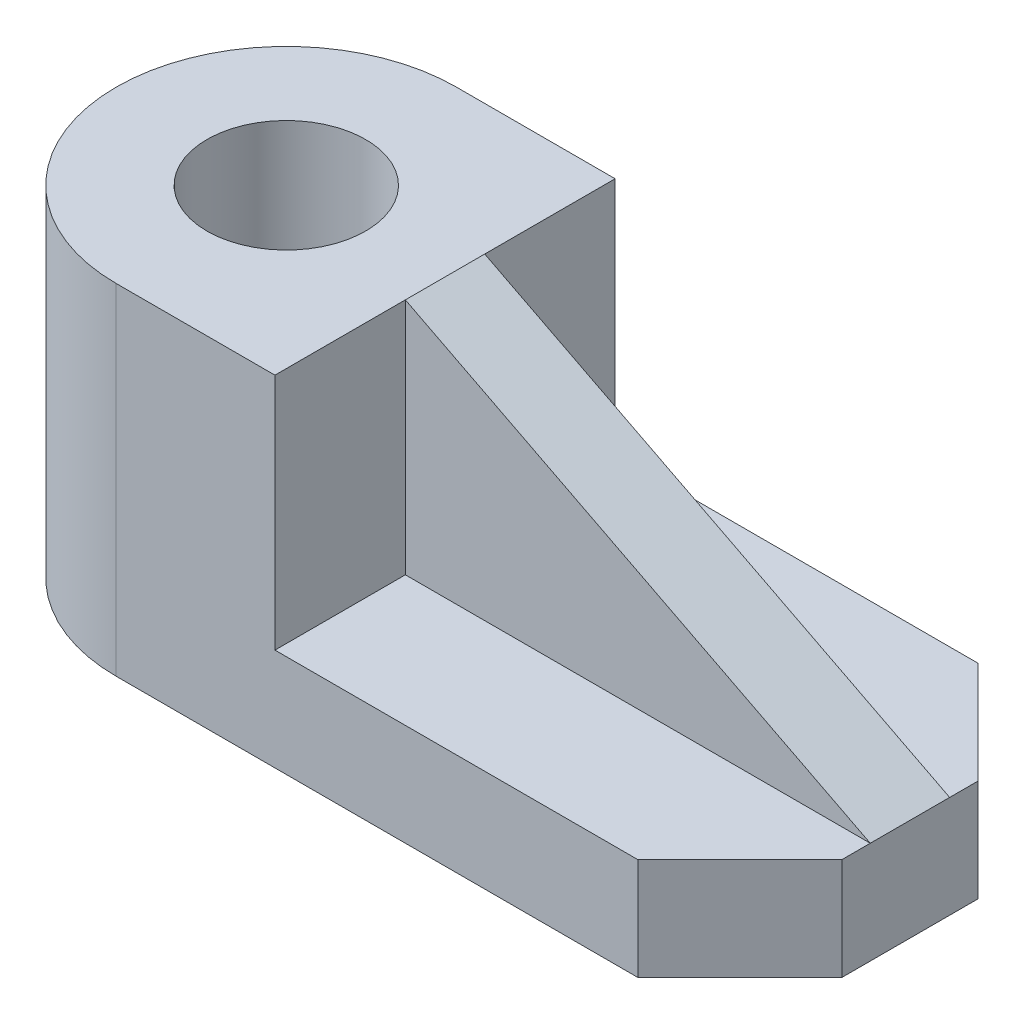
ISO-10303-21;
HEADER;
FILE_DESCRIPTION(('STEP AP214'),'2;1');
FILE_NAME('part.step','',(''),(''),'','','');
FILE_SCHEMA(('AUTOMOTIVE_DESIGN { 1 0 10303 214 1 1 1 1 }'));
ENDSEC;
DATA;
#1=APPLICATION_CONTEXT('core data for automotive mechanical design processes');
#2=APPLICATION_PROTOCOL_DEFINITION('international standard','automotive_design',2000,#1);
#3=PRODUCT_CONTEXT('',#1,'mechanical');
#4=PRODUCT('Part','Part','',(#3));
#5=PRODUCT_RELATED_PRODUCT_CATEGORY('part','',(#4));
#6=PRODUCT_DEFINITION_FORMATION('','',#4);
#7=PRODUCT_DEFINITION_CONTEXT('part definition',#1,'design');
#8=PRODUCT_DEFINITION('design','',#6,#7);
#9=PRODUCT_DEFINITION_SHAPE('','',#8);
#10=(LENGTH_UNIT() NAMED_UNIT(*) SI_UNIT(.MILLI.,.METRE.));
#11=(NAMED_UNIT(*) PLANE_ANGLE_UNIT() SI_UNIT($,.RADIAN.));
#12=(NAMED_UNIT(*) SI_UNIT($,.STERADIAN.) SOLID_ANGLE_UNIT());
#13=UNCERTAINTY_MEASURE_WITH_UNIT(LENGTH_MEASURE(1.E-05),#10,'distance_accuracy_value','');
#14=(GEOMETRIC_REPRESENTATION_CONTEXT(3) GLOBAL_UNCERTAINTY_ASSIGNED_CONTEXT((#13)) GLOBAL_UNIT_ASSIGNED_CONTEXT((#10,
#11,#12)) REPRESENTATION_CONTEXT('',''));
#15=CARTESIAN_POINT('',(0.,0.,0.));
#16=DIRECTION('',(0.,0.,1.));
#17=DIRECTION('',(1.,0.,0.));
#18=AXIS2_PLACEMENT_3D('',#15,#16,#17);
#19=CARTESIAN_POINT('',(-41.,9.,30.));
#20=DIRECTION('',(0.,-1.,0.));
#21=DIRECTION('',(0.,0.,-1.));
#22=AXIS2_PLACEMENT_3D('',#19,#20,#21);
#23=PLANE('',#22);
#24=DIRECTION('',(0.,0.,-1.));
#25=VECTOR('',#24,1.);
#26=CARTESIAN_POINT('',(0.,9.,30.));
#27=LINE('',#26,#25);
#28=CARTESIAN_POINT('',(0.,9.,11.5));
#29=VERTEX_POINT('',#28);
#30=CARTESIAN_POINT('',(0.,9.,9.00000000000004));
#31=VERTEX_POINT('',#30);
#32=EDGE_CURVE('E163',#29,#31,#27,.T.);
#33=ORIENTED_EDGE('',*,*,#32,.T.);
#34=DIRECTION('',(-0.707106781186548,0.,-0.707106781186548));
#35=VECTOR('',#34,1.);
#36=CARTESIAN_POINT('',(0.,9.,9.00000000000004));
#37=LINE('',#36,#35);
#38=CARTESIAN_POINT('',(-9.00000000000005,9.,0.));
#39=VERTEX_POINT('',#38);
#40=EDGE_CURVE('E202',#31,#39,#37,.T.);
#41=ORIENTED_EDGE('',*,*,#40,.T.);
#42=DIRECTION('',(-1.,0.,0.));
#43=VECTOR('',#42,1.);
#44=CARTESIAN_POINT('',(-41.,9.,0.));
#45=LINE('',#44,#43);
#46=CARTESIAN_POINT('',(-41.,9.,0.));
#47=VERTEX_POINT('',#46);
#48=EDGE_CURVE('E155',#39,#47,#45,.T.);
#49=ORIENTED_EDGE('',*,*,#48,.T.);
#50=DIRECTION('',(0.,0.,-1.));
#51=VECTOR('',#50,1.);
#52=CARTESIAN_POINT('',(-41.,9.,30.));
#53=LINE('',#52,#51);
#54=CARTESIAN_POINT('',(-41.,9.,11.5));
#55=VERTEX_POINT('',#54);
#56=EDGE_CURVE('E148',#55,#47,#53,.T.);
#57=ORIENTED_EDGE('',*,*,#56,.F.);
#58=DIRECTION('',(-1.,0.,0.));
#59=VECTOR('',#58,1.);
#60=CARTESIAN_POINT('',(0.,9.,11.5));
#61=LINE('',#60,#59);
#62=EDGE_CURVE('E130',#29,#55,#61,.T.);
#63=ORIENTED_EDGE('',*,*,#62,.F.);
#64=EDGE_LOOP('',(#33,#41,#49,#57,#63));
#65=FACE_BOUND('',#64,.T.);
#66=ADVANCED_FACE('F39',(#65),#23,.F.);
#67=CARTESIAN_POINT('',(-41.,30.,30.));
#68=DIRECTION('',(-1.,0.,0.));
#69=DIRECTION('',(0.,0.,1.));
#70=AXIS2_PLACEMENT_3D('',#67,#68,#69);
#71=PLANE('',#70);
#72=DIRECTION('',(0.,1.,0.));
#73=VECTOR('',#72,1.);
#74=CARTESIAN_POINT('',(-41.,0.,11.5));
#75=LINE('',#74,#73);
#76=CARTESIAN_POINT('',(-41.,30.,11.5));
#77=VERTEX_POINT('',#76);
#78=EDGE_CURVE('E133',#55,#77,#75,.T.);
#79=ORIENTED_EDGE('',*,*,#78,.F.);
#80=ORIENTED_EDGE('',*,*,#56,.T.);
#81=DIRECTION('',(0.,1.,0.));
#82=VECTOR('',#81,1.);
#83=CARTESIAN_POINT('',(-41.,30.,0.));
#84=LINE('',#83,#82);
#85=CARTESIAN_POINT('',(-41.,30.,0.));
#86=VERTEX_POINT('',#85);
#87=EDGE_CURVE('E247',#47,#86,#84,.T.);
#88=ORIENTED_EDGE('',*,*,#87,.T.);
#89=DIRECTION('',(0.,0.,-1.));
#90=VECTOR('',#89,1.);
#91=CARTESIAN_POINT('',(-41.,30.,30.));
#92=LINE('',#91,#90);
#93=EDGE_CURVE('E150',#77,#86,#92,.T.);
#94=ORIENTED_EDGE('',*,*,#93,.F.);
#95=EDGE_LOOP('',(#79,#80,#88,#94));
#96=FACE_BOUND('',#95,.T.);
#97=ADVANCED_FACE('F146',(#96),#71,.F.);
#98=CARTESIAN_POINT('',(0.,9.,30.));
#99=DIRECTION('',(-1.,0.,0.));
#100=DIRECTION('',(0.,-1.,0.));
#101=AXIS2_PLACEMENT_3D('',#98,#99,#100);
#102=PLANE('',#101);
#103=DIRECTION('',(0.,0.,-1.));
#104=VECTOR('',#103,1.);
#105=CARTESIAN_POINT('',(0.,0.,30.));
#106=LINE('',#105,#104);
#107=CARTESIAN_POINT('',(0.,0.,21.));
#108=VERTEX_POINT('',#107);
#109=CARTESIAN_POINT('',(0.,0.,9.00000000000004));
#110=VERTEX_POINT('',#109);
#111=EDGE_CURVE('E244',#108,#110,#106,.T.);
#112=ORIENTED_EDGE('',*,*,#111,.T.);
#113=DIRECTION('',(0.,1.,0.));
#114=VECTOR('',#113,1.);
#115=CARTESIAN_POINT('',(0.,9.,9.00000000000004));
#116=LINE('',#115,#114);
#117=EDGE_CURVE('E198',#110,#31,#116,.T.);
#118=ORIENTED_EDGE('',*,*,#117,.T.);
#119=ORIENTED_EDGE('',*,*,#32,.F.);
#120=DIRECTION('',(0.,0.,1.));
#121=VECTOR('',#120,1.);
#122=CARTESIAN_POINT('',(0.,9.,11.5));
#123=LINE('',#122,#121);
#124=CARTESIAN_POINT('',(0.,9.,18.5));
#125=VERTEX_POINT('',#124);
#126=EDGE_CURVE('E282',#29,#125,#123,.T.);
#127=ORIENTED_EDGE('',*,*,#126,.T.);
#128=CARTESIAN_POINT('',(0.,9.,21.));
#129=VERTEX_POINT('',#128);
#130=EDGE_CURVE('E168',#129,#125,#27,.T.);
#131=ORIENTED_EDGE('',*,*,#130,.F.);
#132=DIRECTION('',(0.,-1.,0.));
#133=VECTOR('',#132,1.);
#134=CARTESIAN_POINT('',(0.,9.,21.));
#135=LINE('',#134,#133);
#136=EDGE_CURVE('E190',#129,#108,#135,.T.);
#137=ORIENTED_EDGE('',*,*,#136,.T.);
#138=EDGE_LOOP('',(#112,#118,#119,#127,#131,#137));
#139=FACE_BOUND('',#138,.T.);
#140=ADVANCED_FACE('F279',(#139),#102,.F.);
#141=DIRECTION('',(-1.,0.,0.));
#142=VECTOR('',#141,1.);
#143=CARTESIAN_POINT('',(-41.,9.,30.));
#144=LINE('',#143,#142);
#145=CARTESIAN_POINT('',(-9.00000000000006,9.,30.));
#146=VERTEX_POINT('',#145);
#147=CARTESIAN_POINT('',(-41.,9.,30.));
#148=VERTEX_POINT('',#147);
#149=EDGE_CURVE('E216',#146,#148,#144,.T.);
#150=ORIENTED_EDGE('',*,*,#149,.F.);
#151=DIRECTION('',(-0.707106781186548,0.,0.707106781186547));
#152=VECTOR('',#151,1.);
#153=CARTESIAN_POINT('',(-9.00000000000005,9.,30.));
#154=LINE('',#153,#152);
#155=EDGE_CURVE('E11',#146,#129,#154,.F.);
#156=ORIENTED_EDGE('',*,*,#155,.T.);
#157=ORIENTED_EDGE('',*,*,#130,.T.);
#158=DIRECTION('',(-1.,0.,0.));
#159=VECTOR('',#158,1.);
#160=CARTESIAN_POINT('',(0.,9.,18.5));
#161=LINE('',#160,#159);
#162=CARTESIAN_POINT('',(-41.,9.,18.5));
#163=VERTEX_POINT('',#162);
#164=EDGE_CURVE('E292',#125,#163,#161,.T.);
#165=ORIENTED_EDGE('',*,*,#164,.T.);
#166=EDGE_CURVE('E157',#148,#163,#53,.T.);
#167=ORIENTED_EDGE('',*,*,#166,.F.);
#168=EDGE_LOOP('',(#150,#156,#157,#165,#167));
#169=FACE_BOUND('',#168,.T.);
#170=ADVANCED_FACE('F220',(#169),#23,.F.);
#171=ORIENTED_EDGE('',*,*,#166,.T.);
#172=DIRECTION('',(0.,1.,0.));
#173=VECTOR('',#172,1.);
#174=CARTESIAN_POINT('',(-41.,0.,18.5));
#175=LINE('',#174,#173);
#176=CARTESIAN_POINT('',(-41.,30.,18.5));
#177=VERTEX_POINT('',#176);
#178=EDGE_CURVE('E445',#163,#177,#175,.T.);
#179=ORIENTED_EDGE('',*,*,#178,.T.);
#180=CARTESIAN_POINT('',(-41.,30.,30.));
#181=VERTEX_POINT('',#180);
#182=EDGE_CURVE('E158',#181,#177,#92,.T.);
#183=ORIENTED_EDGE('',*,*,#182,.F.);
#184=DIRECTION('',(0.,1.,0.));
#185=VECTOR('',#184,1.);
#186=CARTESIAN_POINT('',(-41.,30.,30.));
#187=LINE('',#186,#185);
#188=EDGE_CURVE('E225',#148,#181,#187,.T.);
#189=ORIENTED_EDGE('',*,*,#188,.F.);
#190=EDGE_LOOP('',(#171,#179,#183,#189));
#191=FACE_BOUND('',#190,.T.);
#192=ADVANCED_FACE('F307',(#191),#71,.F.);
#193=CARTESIAN_POINT('',(-70.,30.,30.));
#194=DIRECTION('',(0.,-1.,0.));
#195=DIRECTION('',(0.,0.,-1.));
#196=AXIS2_PLACEMENT_3D('',#193,#194,#195);
#197=PLANE('',#196);
#198=CARTESIAN_POINT('',(-55.,30.,15.));
#199=DIRECTION('',(0.,1.,0.));
#200=DIRECTION('',(0.,0.,1.));
#201=AXIS2_PLACEMENT_3D('',#198,#199,#200);
#202=CIRCLE('',#201,7.);
#203=CARTESIAN_POINT('',(-55.,30.,22.));
#204=VERTEX_POINT('',#203);
#205=EDGE_CURVE('E236',#204,#204,#202,.T.);
#206=ORIENTED_EDGE('',*,*,#205,.F.);
#207=EDGE_LOOP('',(#206));
#208=FACE_BOUND('',#207,.T.);
#209=DIRECTION('',(-1.,0.,0.));
#210=VECTOR('',#209,1.);
#211=CARTESIAN_POINT('',(-70.,30.,0.));
#212=LINE('',#211,#210);
#213=CARTESIAN_POINT('',(-55.,30.,0.));
#214=VERTEX_POINT('',#213);
#215=EDGE_CURVE('E233',#86,#214,#212,.T.);
#216=ORIENTED_EDGE('',*,*,#215,.T.);
#217=CARTESIAN_POINT('',(-55.,30.,15.));
#218=DIRECTION('',(0.,-1.,0.));
#219=DIRECTION('',(0.,0.,-1.));
#220=AXIS2_PLACEMENT_3D('',#217,#218,#219);
#221=CIRCLE('',#220,15.);
#222=CARTESIAN_POINT('',(-70.,30.,15.));
#223=VERTEX_POINT('',#222);
#224=EDGE_CURVE('E184',#214,#223,#221,.F.);
#225=ORIENTED_EDGE('',*,*,#224,.T.);
#226=CARTESIAN_POINT('',(-55.,30.,15.));
#227=DIRECTION('',(0.,-1.,0.));
#228=DIRECTION('',(0.,0.,-1.));
#229=AXIS2_PLACEMENT_3D('',#226,#227,#228);
#230=CIRCLE('',#229,15.);
#231=CARTESIAN_POINT('',(-55.,30.,30.));
#232=VERTEX_POINT('',#231);
#233=EDGE_CURVE('E181',#223,#232,#230,.F.);
#234=ORIENTED_EDGE('',*,*,#233,.T.);
#235=DIRECTION('',(-1.,0.,0.));
#236=VECTOR('',#235,1.);
#237=CARTESIAN_POINT('',(-70.,30.,30.));
#238=LINE('',#237,#236);
#239=EDGE_CURVE('E230',#181,#232,#238,.T.);
#240=ORIENTED_EDGE('',*,*,#239,.F.);
#241=ORIENTED_EDGE('',*,*,#182,.T.);
#242=DIRECTION('',(0.,0.,1.));
#243=VECTOR('',#242,1.);
#244=CARTESIAN_POINT('',(-41.,30.,11.5));
#245=LINE('',#244,#243);
#246=EDGE_CURVE('E142',#77,#177,#245,.T.);
#247=ORIENTED_EDGE('',*,*,#246,.F.);
#248=ORIENTED_EDGE('',*,*,#93,.T.);
#249=EDGE_LOOP('',(#216,#225,#234,#240,#241,#247,#248));
#250=FACE_BOUND('',#249,.T.);
#251=ADVANCED_FACE('F258',(#208,#250),#197,.F.);
#252=CARTESIAN_POINT('',(0.,0.,30.));
#253=DIRECTION('',(0.,1.,0.));
#254=DIRECTION('',(-1.,0.,0.));
#255=AXIS2_PLACEMENT_3D('',#252,#253,#254);
#256=PLANE('',#255);
#257=CARTESIAN_POINT('',(-55.,0.,15.));
#258=DIRECTION('',(0.,1.,0.));
#259=DIRECTION('',(0.,0.,1.));
#260=AXIS2_PLACEMENT_3D('',#257,#258,#259);
#261=CIRCLE('',#260,7.);
#262=CARTESIAN_POINT('',(-55.,0.,22.));
#263=VERTEX_POINT('',#262);
#264=EDGE_CURVE('E195',#263,#263,#261,.T.);
#265=ORIENTED_EDGE('',*,*,#264,.T.);
#266=EDGE_LOOP('',(#265));
#267=FACE_BOUND('',#266,.T.);
#268=DIRECTION('',(1.,0.,0.));
#269=VECTOR('',#268,1.);
#270=CARTESIAN_POINT('',(0.,0.,0.));
#271=LINE('',#270,#269);
#272=CARTESIAN_POINT('',(-55.,0.,0.));
#273=VERTEX_POINT('',#272);
#274=CARTESIAN_POINT('',(-9.00000000000004,0.,0.));
#275=VERTEX_POINT('',#274);
#276=EDGE_CURVE('E226',#273,#275,#271,.T.);
#277=ORIENTED_EDGE('',*,*,#276,.T.);
#278=DIRECTION('',(0.707106781186548,0.,0.707106781186548));
#279=VECTOR('',#278,1.);
#280=CARTESIAN_POINT('',(0.,0.,9.00000000000004));
#281=LINE('',#280,#279);
#282=EDGE_CURVE('E210',#275,#110,#281,.T.);
#283=ORIENTED_EDGE('',*,*,#282,.T.);
#284=ORIENTED_EDGE('',*,*,#111,.F.);
#285=DIRECTION('',(0.707106781186548,0.,-0.707106781186547));
#286=VECTOR('',#285,1.);
#287=CARTESIAN_POINT('',(-9.00000000000005,0.,30.));
#288=LINE('',#287,#286);
#289=CARTESIAN_POINT('',(-9.00000000000005,0.,30.));
#290=VERTEX_POINT('',#289);
#291=EDGE_CURVE('E61',#108,#290,#288,.F.);
#292=ORIENTED_EDGE('',*,*,#291,.T.);
#293=DIRECTION('',(1.,0.,0.));
#294=VECTOR('',#293,1.);
#295=CARTESIAN_POINT('',(0.,0.,30.));
#296=LINE('',#295,#294);
#297=CARTESIAN_POINT('',(-55.,0.,30.));
#298=VERTEX_POINT('',#297);
#299=EDGE_CURVE('E218',#298,#290,#296,.T.);
#300=ORIENTED_EDGE('',*,*,#299,.F.);
#301=CARTESIAN_POINT('',(-55.,0.,15.));
#302=DIRECTION('',(0.,1.,0.));
#303=DIRECTION('',(-1.,0.,0.));
#304=AXIS2_PLACEMENT_3D('',#301,#302,#303);
#305=CIRCLE('',#304,15.);
#306=CARTESIAN_POINT('',(-70.,0.,15.));
#307=VERTEX_POINT('',#306);
#308=EDGE_CURVE('E171',#298,#307,#305,.F.);
#309=ORIENTED_EDGE('',*,*,#308,.T.);
#310=CARTESIAN_POINT('',(-55.,0.,15.));
#311=DIRECTION('',(0.,1.,0.));
#312=DIRECTION('',(-1.,0.,0.));
#313=AXIS2_PLACEMENT_3D('',#310,#311,#312);
#314=CIRCLE('',#313,15.);
#315=EDGE_CURVE('E174',#307,#273,#314,.F.);
#316=ORIENTED_EDGE('',*,*,#315,.T.);
#317=EDGE_LOOP('',(#277,#283,#284,#292,#300,#309,#316));
#318=FACE_BOUND('',#317,.T.);
#319=ADVANCED_FACE('F274',(#267,#318),#256,.F.);
#320=CARTESIAN_POINT('',(0.,0.,30.));
#321=DIRECTION('',(0.,0.,-1.));
#322=DIRECTION('',(-1.,0.,0.));
#323=AXIS2_PLACEMENT_3D('',#320,#321,#322);
#324=PLANE('',#323);
#325=ORIENTED_EDGE('',*,*,#299,.T.);
#326=DIRECTION('',(0.,1.,0.));
#327=VECTOR('',#326,1.);
#328=CARTESIAN_POINT('',(-9.00000000000005,0.,30.));
#329=LINE('',#328,#327);
#330=EDGE_CURVE('E48',#290,#146,#329,.T.);
#331=ORIENTED_EDGE('',*,*,#330,.T.);
#332=ORIENTED_EDGE('',*,*,#149,.T.);
#333=ORIENTED_EDGE('',*,*,#188,.T.);
#334=ORIENTED_EDGE('',*,*,#239,.T.);
#335=DIRECTION('',(0.,-1.,0.));
#336=VECTOR('',#335,1.);
#337=CARTESIAN_POINT('',(-55.,0.,30.));
#338=LINE('',#337,#336);
#339=EDGE_CURVE('E187',#232,#298,#338,.T.);
#340=ORIENTED_EDGE('',*,*,#339,.T.);
#341=EDGE_LOOP('',(#325,#331,#332,#333,#334,#340));
#342=FACE_BOUND('',#341,.T.);
#343=ADVANCED_FACE('F215',(#342),#324,.F.);
#344=CARTESIAN_POINT('',(0.,0.,0.));
#345=DIRECTION('',(0.,0.,-1.));
#346=DIRECTION('',(-1.,0.,0.));
#347=AXIS2_PLACEMENT_3D('',#344,#345,#346);
#348=PLANE('',#347);
#349=ORIENTED_EDGE('',*,*,#48,.F.);
#350=DIRECTION('',(0.,-1.,0.));
#351=VECTOR('',#350,1.);
#352=CARTESIAN_POINT('',(-9.00000000000004,0.,0.));
#353=LINE('',#352,#351);
#354=EDGE_CURVE('E205',#39,#275,#353,.T.);
#355=ORIENTED_EDGE('',*,*,#354,.T.);
#356=ORIENTED_EDGE('',*,*,#276,.F.);
#357=DIRECTION('',(0.,-1.,0.));
#358=VECTOR('',#357,1.);
#359=CARTESIAN_POINT('',(-55.,30.,0.));
#360=LINE('',#359,#358);
#361=EDGE_CURVE('E177',#273,#214,#360,.F.);
#362=ORIENTED_EDGE('',*,*,#361,.T.);
#363=ORIENTED_EDGE('',*,*,#215,.F.);
#364=ORIENTED_EDGE('',*,*,#87,.F.);
#365=EDGE_LOOP('',(#349,#355,#356,#362,#363,#364));
#366=FACE_BOUND('',#365,.T.);
#367=ADVANCED_FACE('F261',(#366),#348,.T.);
#368=CARTESIAN_POINT('',(-55.,0.,15.));
#369=DIRECTION('',(0.,-1.,0.));
#370=DIRECTION('',(0.,0.,-1.));
#371=AXIS2_PLACEMENT_3D('',#368,#369,#370);
#372=CYLINDRICAL_SURFACE('',#371,15.);
#373=ORIENTED_EDGE('',*,*,#339,.F.);
#374=ORIENTED_EDGE('',*,*,#233,.F.);
#375=DIRECTION('',(0.,-1.,0.));
#376=VECTOR('',#375,1.);
#377=CARTESIAN_POINT('',(-70.,0.,15.));
#378=LINE('',#377,#376);
#379=EDGE_CURVE('E191',#307,#223,#378,.F.);
#380=ORIENTED_EDGE('',*,*,#379,.F.);
#381=ORIENTED_EDGE('',*,*,#308,.F.);
#382=EDGE_LOOP('',(#373,#374,#380,#381));
#383=FACE_BOUND('',#382,.T.);
#384=ADVANCED_FACE('F272',(#383),#372,.T.);
#385=CARTESIAN_POINT('',(-55.,0.,15.));
#386=DIRECTION('',(0.,1.,0.));
#387=DIRECTION('',(0.,0.,1.));
#388=AXIS2_PLACEMENT_3D('',#385,#386,#387);
#389=CYLINDRICAL_SURFACE('',#388,15.);
#390=ORIENTED_EDGE('',*,*,#224,.F.);
#391=ORIENTED_EDGE('',*,*,#361,.F.);
#392=ORIENTED_EDGE('',*,*,#315,.F.);
#393=ORIENTED_EDGE('',*,*,#379,.T.);
#394=EDGE_LOOP('',(#390,#391,#392,#393));
#395=FACE_BOUND('',#394,.T.);
#396=ADVANCED_FACE('F266',(#395),#389,.T.);
#397=CARTESIAN_POINT('',(-55.,0.,15.));
#398=DIRECTION('',(0.,1.,0.));
#399=DIRECTION('',(0.,0.,1.));
#400=AXIS2_PLACEMENT_3D('',#397,#398,#399);
#401=CYLINDRICAL_SURFACE('',#400,7.);
#402=ORIENTED_EDGE('',*,*,#264,.F.);
#403=EDGE_LOOP('',(#402));
#404=FACE_BOUND('',#403,.T.);
#405=ORIENTED_EDGE('',*,*,#205,.T.);
#406=EDGE_LOOP('',(#405));
#407=FACE_BOUND('',#406,.T.);
#408=ADVANCED_FACE('F299',(#404,#407),#401,.F.);
#409=CARTESIAN_POINT('',(3.65174363807729,7.12959472196042,11.5));
#410=DIRECTION('',(-0.455875869805658,-0.890043364858665,0.));
#411=DIRECTION('',(0.890043364858665,-0.455875869805658,0.));
#412=AXIS2_PLACEMENT_3D('',#409,#410,#411);
#413=PLANE('',#412);
#414=DIRECTION('',(0.890043364858665,-0.455875869805658,0.));
#415=VECTOR('',#414,1.);
#416=CARTESIAN_POINT('',(3.65174363807729,7.12959472196042,18.5));
#417=LINE('',#416,#415);
#418=EDGE_CURVE('E441',#177,#125,#417,.T.);
#419=ORIENTED_EDGE('',*,*,#418,.T.);
#420=ORIENTED_EDGE('',*,*,#126,.F.);
#421=DIRECTION('',(0.890043364858665,-0.455875869805658,0.));
#422=VECTOR('',#421,1.);
#423=CARTESIAN_POINT('',(3.65174363807729,7.12959472196042,11.5));
#424=LINE('',#423,#422);
#425=EDGE_CURVE('E135',#77,#29,#424,.T.);
#426=ORIENTED_EDGE('',*,*,#425,.F.);
#427=ORIENTED_EDGE('',*,*,#246,.T.);
#428=EDGE_LOOP('',(#419,#420,#426,#427));
#429=FACE_BOUND('',#428,.T.);
#430=ADVANCED_FACE('F302',(#429),#413,.F.);
#431=CARTESIAN_POINT('',(0.,0.,11.5));
#432=DIRECTION('',(0.,0.,1.));
#433=DIRECTION('',(1.,0.,0.));
#434=AXIS2_PLACEMENT_3D('',#431,#432,#433);
#435=PLANE('',#434);
#436=ORIENTED_EDGE('',*,*,#425,.T.);
#437=ORIENTED_EDGE('',*,*,#62,.T.);
#438=ORIENTED_EDGE('',*,*,#78,.T.);
#439=EDGE_LOOP('',(#436,#437,#438));
#440=FACE_BOUND('',#439,.T.);
#441=ADVANCED_FACE('F132',(#440),#435,.F.);
#442=CARTESIAN_POINT('',(0.,0.,18.5));
#443=DIRECTION('',(0.,0.,1.));
#444=DIRECTION('',(1.,0.,0.));
#445=AXIS2_PLACEMENT_3D('',#442,#443,#444);
#446=PLANE('',#445);
#447=ORIENTED_EDGE('',*,*,#418,.F.);
#448=ORIENTED_EDGE('',*,*,#178,.F.);
#449=ORIENTED_EDGE('',*,*,#164,.F.);
#450=EDGE_LOOP('',(#447,#448,#449));
#451=FACE_BOUND('',#450,.T.);
#452=ADVANCED_FACE('F333',(#451),#446,.T.);
#453=CARTESIAN_POINT('',(0.,9.,9.00000000000004));
#454=DIRECTION('',(0.707106781186548,0.,-0.707106781186548));
#455=DIRECTION('',(0.,-1.,0.));
#456=AXIS2_PLACEMENT_3D('',#453,#454,#455);
#457=PLANE('',#456);
#458=ORIENTED_EDGE('',*,*,#282,.F.);
#459=ORIENTED_EDGE('',*,*,#354,.F.);
#460=ORIENTED_EDGE('',*,*,#40,.F.);
#461=ORIENTED_EDGE('',*,*,#117,.F.);
#462=EDGE_LOOP('',(#458,#459,#460,#461));
#463=FACE_BOUND('',#462,.T.);
#464=ADVANCED_FACE('F278',(#463),#457,.T.);
#465=CARTESIAN_POINT('',(-9.00000000000005,0.,30.));
#466=DIRECTION('',(-0.707106781186547,0.,-0.707106781186548));
#467=DIRECTION('',(0.,1.,0.));
#468=AXIS2_PLACEMENT_3D('',#465,#466,#467);
#469=PLANE('',#468);
#470=ORIENTED_EDGE('',*,*,#291,.F.);
#471=ORIENTED_EDGE('',*,*,#136,.F.);
#472=ORIENTED_EDGE('',*,*,#155,.F.);
#473=ORIENTED_EDGE('',*,*,#330,.F.);
#474=EDGE_LOOP('',(#470,#471,#472,#473));
#475=FACE_BOUND('',#474,.T.);
#476=ADVANCED_FACE('F41',(#475),#469,.F.);
#477=CLOSED_SHELL('',(#66,#97,#140,#170,#192,#251,#319,#343,#367,#384,#396,#408,#430,#441,#452,
#464,#476));
#478=MANIFOLD_SOLID_BREP('B2',#477);
#479=ADVANCED_BREP_SHAPE_REPRESENTATION('',(#18,#478),#14);
#480=SHAPE_DEFINITION_REPRESENTATION(#9,#479);
ENDSEC;
END-ISO-10303-21;
